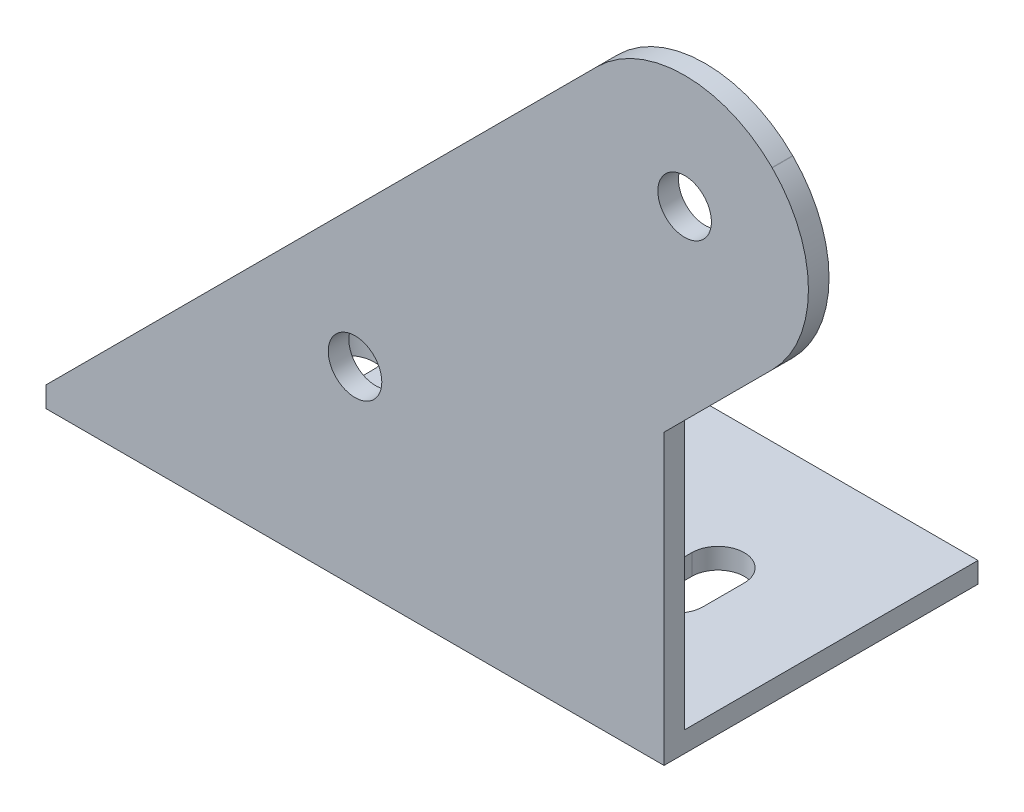
ISO-10303-21;
HEADER;
FILE_DESCRIPTION(('STEP AP214'),'2;1');
FILE_NAME('part.step','',(''),(''),'','','');
FILE_SCHEMA(('AUTOMOTIVE_DESIGN { 1 0 10303 214 1 1 1 1 }'));
ENDSEC;
DATA;
#1=APPLICATION_CONTEXT('core data for automotive mechanical design processes');
#2=APPLICATION_PROTOCOL_DEFINITION('international standard','automotive_design',2000,#1);
#3=PRODUCT_CONTEXT('',#1,'mechanical');
#4=PRODUCT('Part','Part','',(#3));
#5=PRODUCT_RELATED_PRODUCT_CATEGORY('part','',(#4));
#6=PRODUCT_DEFINITION_FORMATION('','',#4);
#7=PRODUCT_DEFINITION_CONTEXT('part definition',#1,'design');
#8=PRODUCT_DEFINITION('design','',#6,#7);
#9=PRODUCT_DEFINITION_SHAPE('','',#8);
#10=(LENGTH_UNIT() NAMED_UNIT(*) SI_UNIT(.MILLI.,.METRE.));
#11=(NAMED_UNIT(*) PLANE_ANGLE_UNIT() SI_UNIT($,.RADIAN.));
#12=(NAMED_UNIT(*) SI_UNIT($,.STERADIAN.) SOLID_ANGLE_UNIT());
#13=UNCERTAINTY_MEASURE_WITH_UNIT(LENGTH_MEASURE(1.E-05),#10,'distance_accuracy_value','');
#14=(GEOMETRIC_REPRESENTATION_CONTEXT(3) GLOBAL_UNCERTAINTY_ASSIGNED_CONTEXT((#13)) GLOBAL_UNIT_ASSIGNED_CONTEXT((#10,
#11,#12)) REPRESENTATION_CONTEXT('',''));
#15=CARTESIAN_POINT('',(0.,0.,0.));
#16=DIRECTION('',(0.,0.,1.));
#17=DIRECTION('',(1.,0.,0.));
#18=AXIS2_PLACEMENT_3D('',#15,#16,#17);
#19=CARTESIAN_POINT('',(0.,32.5735931288073,5.));
#20=DIRECTION('',(0.,0.,-1.));
#21=DIRECTION('',(-1.,0.,0.));
#22=AXIS2_PLACEMENT_3D('',#19,#20,#21);
#23=PLANE('',#22);
#24=DIRECTION('',(0.,1.,0.));
#25=VECTOR('',#24,1.);
#26=CARTESIAN_POINT('',(75.,-5.,5.));
#27=LINE('',#26,#25);
#28=CARTESIAN_POINT('',(75.,-5.,5.));
#29=VERTEX_POINT('',#28);
#30=CARTESIAN_POINT('',(75.,65.0472719955607,5.));
#31=VERTEX_POINT('',#30);
#32=EDGE_CURVE('E281',#29,#31,#27,.T.);
#33=ORIENTED_EDGE('',*,*,#32,.T.);
#34=DIRECTION('',(0.707106781186549,0.707106781186546,0.));
#35=VECTOR('',#34,1.);
#36=CARTESIAN_POINT('',(101.263160566622,91.3104325621828,5.));
#37=LINE('',#36,#35);
#38=CARTESIAN_POINT('',(101.263160566622,91.3104325621828,5.));
#39=VERTEX_POINT('',#38);
#40=EDGE_CURVE('E488',#31,#39,#37,.T.);
#41=ORIENTED_EDGE('',*,*,#40,.T.);
#42=CARTESIAN_POINT('',(80.0499571310259,112.523635997779,5.));
#43=DIRECTION('',(0.,0.,-1.));
#44=DIRECTION('',(-1.,0.,0.));
#45=AXIS2_PLACEMENT_3D('',#42,#43,#44);
#46=CIRCLE('',#45,30.);
#47=CARTESIAN_POINT('',(101.263160566622,133.736839433376,5.));
#48=VERTEX_POINT('',#47);
#49=EDGE_CURVE('E490',#39,#48,#46,.F.);
#50=ORIENTED_EDGE('',*,*,#49,.T.);
#51=DIRECTION('',(-0.707106781186548,0.707106781186548,0.));
#52=VECTOR('',#51,1.);
#53=CARTESIAN_POINT('',(101.213203435596,133.786796564402,5.));
#54=LINE('',#53,#52);
#55=CARTESIAN_POINT('',(101.213203435596,133.786796564402,5.));
#56=VERTEX_POINT('',#55);
#57=EDGE_CURVE('E493',#48,#56,#54,.T.);
#58=ORIENTED_EDGE('',*,*,#57,.T.);
#59=CARTESIAN_POINT('',(79.9999999999998,112.573593128806,5.));
#60=DIRECTION('',(0.,0.,-1.));
#61=DIRECTION('',(-1.,0.,0.));
#62=AXIS2_PLACEMENT_3D('',#59,#60,#61);
#63=CIRCLE('',#62,30.);
#64=CARTESIAN_POINT('',(58.7867965644033,133.786796564402,5.));
#65=VERTEX_POINT('',#64);
#66=EDGE_CURVE('E194',#56,#65,#63,.F.);
#67=ORIENTED_EDGE('',*,*,#66,.T.);
#68=DIRECTION('',(-0.707106781186546,-0.707106781186549,0.));
#69=VECTOR('',#68,1.);
#70=CARTESIAN_POINT('',(-75.,0.,5.));
#71=LINE('',#70,#69);
#72=CARTESIAN_POINT('',(-75.,0.,5.));
#73=VERTEX_POINT('',#72);
#74=EDGE_CURVE('E44',#65,#73,#71,.T.);
#75=ORIENTED_EDGE('',*,*,#74,.T.);
#76=DIRECTION('',(0.,1.,0.));
#77=VECTOR('',#76,1.);
#78=CARTESIAN_POINT('',(-75.,-5.,5.));
#79=LINE('',#78,#77);
#80=CARTESIAN_POINT('',(-75.,-5.,5.));
#81=VERTEX_POINT('',#80);
#82=EDGE_CURVE('E274',#81,#73,#79,.T.);
#83=ORIENTED_EDGE('',*,*,#82,.F.);
#84=DIRECTION('',(-1.,0.,0.));
#85=VECTOR('',#84,1.);
#86=CARTESIAN_POINT('',(-75.,-5.,5.));
#87=LINE('',#86,#85);
#88=EDGE_CURVE('E272',#29,#81,#87,.T.);
#89=ORIENTED_EDGE('',*,*,#88,.F.);
#90=EDGE_LOOP('',(#33,#41,#50,#58,#67,#75,#83,#89));
#91=FACE_BOUND('',#90,.T.);
#92=CARTESIAN_POINT('',(0.,41.325890400855,5.));
#93=DIRECTION('',(0.,0.,1.));
#94=DIRECTION('',(1.,0.,0.));
#95=AXIS2_PLACEMENT_3D('',#92,#93,#94);
#96=CIRCLE('',#95,6.5);
#97=CARTESIAN_POINT('',(6.5,41.325890400855,5.));
#98=VERTEX_POINT('',#97);
#99=EDGE_CURVE('E165',#98,#98,#96,.T.);
#100=ORIENTED_EDGE('',*,*,#99,.F.);
#101=EDGE_LOOP('',(#100));
#102=FACE_BOUND('',#101,.T.);
#103=CARTESIAN_POINT('',(80.,115.,5.));
#104=DIRECTION('',(0.,0.,-1.));
#105=DIRECTION('',(-1.,0.,0.));
#106=AXIS2_PLACEMENT_3D('',#103,#104,#105);
#107=CIRCLE('',#106,6.5);
#108=CARTESIAN_POINT('',(73.5,115.,5.));
#109=VERTEX_POINT('',#108);
#110=EDGE_CURVE('E215',#109,#109,#107,.F.);
#111=ORIENTED_EDGE('',*,*,#110,.F.);
#112=EDGE_LOOP('',(#111));
#113=FACE_BOUND('',#112,.T.);
#114=ADVANCED_FACE('F35',(#91,#102,#113),#23,.F.);
#115=CARTESIAN_POINT('',(0.,32.5735931288073,0.));
#116=DIRECTION('',(0.,0.,-1.));
#117=DIRECTION('',(-1.,0.,0.));
#118=AXIS2_PLACEMENT_3D('',#115,#116,#117);
#119=PLANE('',#118);
#120=DIRECTION('',(-0.707106781186546,-0.707106781186549,0.));
#121=VECTOR('',#120,1.);
#122=CARTESIAN_POINT('',(-75.,0.,0.));
#123=LINE('',#122,#121);
#124=CARTESIAN_POINT('',(58.7867965644033,133.786796564402,0.));
#125=VERTEX_POINT('',#124);
#126=CARTESIAN_POINT('',(-75.,0.,0.));
#127=VERTEX_POINT('',#126);
#128=EDGE_CURVE('E153',#125,#127,#123,.T.);
#129=ORIENTED_EDGE('',*,*,#128,.F.);
#130=CARTESIAN_POINT('',(79.9999999999998,112.573593128806,0.));
#131=DIRECTION('',(0.,0.,-1.));
#132=DIRECTION('',(-1.,0.,0.));
#133=AXIS2_PLACEMENT_3D('',#130,#131,#132);
#134=CIRCLE('',#133,30.);
#135=CARTESIAN_POINT('',(101.213203435596,133.786796564402,0.));
#136=VERTEX_POINT('',#135);
#137=EDGE_CURVE('E159',#125,#136,#134,.T.);
#138=ORIENTED_EDGE('',*,*,#137,.T.);
#139=DIRECTION('',(0.707106781186548,-0.707106781186548,0.));
#140=VECTOR('',#139,1.);
#141=CARTESIAN_POINT('',(101.213203435596,133.786796564402,0.));
#142=LINE('',#141,#140);
#143=CARTESIAN_POINT('',(101.263160566622,133.736839433376,0.));
#144=VERTEX_POINT('',#143);
#145=EDGE_CURVE('E177',#136,#144,#142,.T.);
#146=ORIENTED_EDGE('',*,*,#145,.T.);
#147=CARTESIAN_POINT('',(80.0499571310259,112.523635997779,0.));
#148=DIRECTION('',(0.,0.,-1.));
#149=DIRECTION('',(-1.,0.,0.));
#150=AXIS2_PLACEMENT_3D('',#147,#148,#149);
#151=CIRCLE('',#150,30.);
#152=CARTESIAN_POINT('',(101.263160566622,91.3104325621828,0.));
#153=VERTEX_POINT('',#152);
#154=EDGE_CURVE('E180',#144,#153,#151,.T.);
#155=ORIENTED_EDGE('',*,*,#154,.T.);
#156=DIRECTION('',(-0.707106781186549,-0.707106781186546,0.));
#157=VECTOR('',#156,1.);
#158=CARTESIAN_POINT('',(101.263160566622,91.3104325621828,0.));
#159=LINE('',#158,#157);
#160=CARTESIAN_POINT('',(75.,65.0472719955607,0.));
#161=VERTEX_POINT('',#160);
#162=EDGE_CURVE('E188',#153,#161,#159,.T.);
#163=ORIENTED_EDGE('',*,*,#162,.T.);
#164=DIRECTION('',(0.,-1.,0.));
#165=VECTOR('',#164,1.);
#166=CARTESIAN_POINT('',(75.,0.,0.));
#167=LINE('',#166,#165);
#168=CARTESIAN_POINT('',(75.,0.,0.));
#169=VERTEX_POINT('',#168);
#170=EDGE_CURVE('E172',#161,#169,#167,.T.);
#171=ORIENTED_EDGE('',*,*,#170,.T.);
#172=DIRECTION('',(1.,0.,0.));
#173=VECTOR('',#172,1.);
#174=CARTESIAN_POINT('',(75.,0.,0.));
#175=LINE('',#174,#173);
#176=EDGE_CURVE('E162',#127,#169,#175,.T.);
#177=ORIENTED_EDGE('',*,*,#176,.F.);
#178=EDGE_LOOP('',(#129,#138,#146,#155,#163,#171,#177));
#179=FACE_BOUND('',#178,.T.);
#180=CARTESIAN_POINT('',(80.,115.,0.));
#181=DIRECTION('',(0.,0.,-1.));
#182=DIRECTION('',(-1.,0.,0.));
#183=AXIS2_PLACEMENT_3D('',#180,#181,#182);
#184=CIRCLE('',#183,6.5);
#185=CARTESIAN_POINT('',(73.5,115.,0.));
#186=VERTEX_POINT('',#185);
#187=EDGE_CURVE('E178',#186,#186,#184,.T.);
#188=ORIENTED_EDGE('',*,*,#187,.F.);
#189=EDGE_LOOP('',(#188));
#190=FACE_BOUND('',#189,.T.);
#191=CARTESIAN_POINT('',(0.,41.325890400855,0.));
#192=DIRECTION('',(0.,0.,1.));
#193=DIRECTION('',(1.,0.,0.));
#194=AXIS2_PLACEMENT_3D('',#191,#192,#193);
#195=CIRCLE('',#194,6.5);
#196=CARTESIAN_POINT('',(6.5,41.325890400855,0.));
#197=VERTEX_POINT('',#196);
#198=EDGE_CURVE('E289',#197,#197,#195,.T.);
#199=ORIENTED_EDGE('',*,*,#198,.T.);
#200=EDGE_LOOP('',(#199));
#201=FACE_BOUND('',#200,.T.);
#202=ADVANCED_FACE('F155',(#179,#190,#201),#119,.T.);
#203=CARTESIAN_POINT('',(-75.,0.,5.));
#204=DIRECTION('',(0.707106781186549,-0.707106781186546,0.));
#205=DIRECTION('',(0.707106781186546,0.707106781186549,0.));
#206=AXIS2_PLACEMENT_3D('',#203,#204,#205);
#207=PLANE('',#206);
#208=ORIENTED_EDGE('',*,*,#128,.T.);
#209=DIRECTION('',(0.,0.,-1.));
#210=VECTOR('',#209,1.);
#211=CARTESIAN_POINT('',(-75.,0.,5.));
#212=LINE('',#211,#210);
#213=EDGE_CURVE('E11',#73,#127,#212,.T.);
#214=ORIENTED_EDGE('',*,*,#213,.F.);
#215=ORIENTED_EDGE('',*,*,#74,.F.);
#216=DIRECTION('',(0.,0.,-1.));
#217=VECTOR('',#216,1.);
#218=CARTESIAN_POINT('',(58.7867965644033,133.786796564402,238.603758728007));
#219=LINE('',#218,#217);
#220=EDGE_CURVE('E168',#65,#125,#219,.T.);
#221=ORIENTED_EDGE('',*,*,#220,.T.);
#222=EDGE_LOOP('',(#208,#214,#215,#221));
#223=FACE_BOUND('',#222,.T.);
#224=ADVANCED_FACE('F37',(#223),#207,.F.);
#225=CARTESIAN_POINT('',(0.,41.325890400855,5.));
#226=DIRECTION('',(0.,0.,-1.));
#227=DIRECTION('',(-1.,0.,0.));
#228=AXIS2_PLACEMENT_3D('',#225,#226,#227);
#229=CYLINDRICAL_SURFACE('',#228,6.5);
#230=ORIENTED_EDGE('',*,*,#99,.T.);
#231=EDGE_LOOP('',(#230));
#232=FACE_BOUND('',#231,.T.);
#233=ORIENTED_EDGE('',*,*,#198,.F.);
#234=EDGE_LOOP('',(#233));
#235=FACE_BOUND('',#234,.T.);
#236=ADVANCED_FACE('F320',(#232,#235),#229,.F.);
#237=CARTESIAN_POINT('',(0.,-5.,0.));
#238=DIRECTION('',(0.,1.,0.));
#239=DIRECTION('',(0.,0.,1.));
#240=AXIS2_PLACEMENT_3D('',#237,#238,#239);
#241=PLANE('',#240);
#242=CARTESIAN_POINT('',(-45.,-5.,-28.1));
#243=DIRECTION('',(0.,-1.,0.));
#244=DIRECTION('',(0.,0.,-1.));
#245=AXIS2_PLACEMENT_3D('',#242,#243,#244);
#246=CIRCLE('',#245,6.51840468515783);
#247=CARTESIAN_POINT('',(-38.4815953148422,-5.,-28.1));
#248=VERTEX_POINT('',#247);
#249=CARTESIAN_POINT('',(-51.5184046851578,-5.,-28.1));
#250=VERTEX_POINT('',#249);
#251=EDGE_CURVE('E233',#248,#250,#246,.T.);
#252=ORIENTED_EDGE('',*,*,#251,.F.);
#253=DIRECTION('',(0.,0.,1.));
#254=VECTOR('',#253,1.);
#255=CARTESIAN_POINT('',(-38.4815953148422,-5.,-28.1));
#256=LINE('',#255,#254);
#257=CARTESIAN_POINT('',(-38.4815953148422,-5.,-38.1));
#258=VERTEX_POINT('',#257);
#259=EDGE_CURVE('E241',#258,#248,#256,.T.);
#260=ORIENTED_EDGE('',*,*,#259,.F.);
#261=CARTESIAN_POINT('',(-45.,-5.,-38.1));
#262=DIRECTION('',(0.,-1.,0.));
#263=DIRECTION('',(0.,0.,-1.));
#264=AXIS2_PLACEMENT_3D('',#261,#262,#263);
#265=CIRCLE('',#264,6.51840468515783);
#266=CARTESIAN_POINT('',(-51.5184046851578,-5.,-38.1));
#267=VERTEX_POINT('',#266);
#268=EDGE_CURVE('E238',#267,#258,#265,.T.);
#269=ORIENTED_EDGE('',*,*,#268,.F.);
#270=DIRECTION('',(0.,0.,-1.));
#271=VECTOR('',#270,1.);
#272=CARTESIAN_POINT('',(-51.5184046851578,-5.,-28.1));
#273=LINE('',#272,#271);
#274=EDGE_CURVE('E235',#250,#267,#273,.T.);
#275=ORIENTED_EDGE('',*,*,#274,.F.);
#276=EDGE_LOOP('',(#252,#260,#269,#275));
#277=FACE_BOUND('',#276,.T.);
#278=DIRECTION('',(0.,0.,-1.));
#279=VECTOR('',#278,1.);
#280=CARTESIAN_POINT('',(-75.,-5.,-71.2));
#281=LINE('',#280,#279);
#282=CARTESIAN_POINT('',(-75.,-5.,-71.2));
#283=VERTEX_POINT('',#282);
#284=EDGE_CURVE('E264',#81,#283,#281,.T.);
#285=ORIENTED_EDGE('',*,*,#284,.T.);
#286=DIRECTION('',(1.,0.,0.));
#287=VECTOR('',#286,1.);
#288=CARTESIAN_POINT('',(-75.,-5.,-71.2));
#289=LINE('',#288,#287);
#290=CARTESIAN_POINT('',(75.,-5.,-71.2));
#291=VERTEX_POINT('',#290);
#292=EDGE_CURVE('E267',#283,#291,#289,.T.);
#293=ORIENTED_EDGE('',*,*,#292,.T.);
#294=DIRECTION('',(0.,0.,1.));
#295=VECTOR('',#294,1.);
#296=CARTESIAN_POINT('',(75.,-5.,-71.2));
#297=LINE('',#296,#295);
#298=EDGE_CURVE('E270',#291,#29,#297,.T.);
#299=ORIENTED_EDGE('',*,*,#298,.T.);
#300=ORIENTED_EDGE('',*,*,#88,.T.);
#301=EDGE_LOOP('',(#285,#293,#299,#300));
#302=FACE_BOUND('',#301,.T.);
#303=CARTESIAN_POINT('',(45.,-5.,-28.1));
#304=DIRECTION('',(0.,-1.,0.));
#305=DIRECTION('',(0.,0.,-1.));
#306=AXIS2_PLACEMENT_3D('',#303,#304,#305);
#307=CIRCLE('',#306,6.37253144016551);
#308=CARTESIAN_POINT('',(51.3725314401655,-5.,-28.1));
#309=VERTEX_POINT('',#308);
#310=CARTESIAN_POINT('',(38.6274685598345,-5.,-28.1));
#311=VERTEX_POINT('',#310);
#312=EDGE_CURVE('E200',#309,#311,#307,.T.);
#313=ORIENTED_EDGE('',*,*,#312,.F.);
#314=DIRECTION('',(0.,0.,1.));
#315=VECTOR('',#314,1.);
#316=CARTESIAN_POINT('',(51.3725314401655,-5.,-28.1));
#317=LINE('',#316,#315);
#318=CARTESIAN_POINT('',(51.3725314401655,-5.,-38.1));
#319=VERTEX_POINT('',#318);
#320=EDGE_CURVE('E208',#319,#309,#317,.T.);
#321=ORIENTED_EDGE('',*,*,#320,.F.);
#322=CARTESIAN_POINT('',(45.,-5.,-38.1));
#323=DIRECTION('',(0.,-1.,0.));
#324=DIRECTION('',(0.,0.,-1.));
#325=AXIS2_PLACEMENT_3D('',#322,#323,#324);
#326=CIRCLE('',#325,6.37253144016551);
#327=CARTESIAN_POINT('',(38.6274685598345,-5.,-38.1));
#328=VERTEX_POINT('',#327);
#329=EDGE_CURVE('E205',#328,#319,#326,.T.);
#330=ORIENTED_EDGE('',*,*,#329,.F.);
#331=DIRECTION('',(0.,0.,-1.));
#332=VECTOR('',#331,1.);
#333=CARTESIAN_POINT('',(38.6274685598345,-5.,-28.1));
#334=LINE('',#333,#332);
#335=EDGE_CURVE('E202',#311,#328,#334,.T.);
#336=ORIENTED_EDGE('',*,*,#335,.F.);
#337=EDGE_LOOP('',(#313,#321,#330,#336));
#338=FACE_BOUND('',#337,.T.);
#339=ADVANCED_FACE('F317',(#277,#302,#338),#241,.F.);
#340=CARTESIAN_POINT('',(0.,0.,0.));
#341=DIRECTION('',(0.,1.,0.));
#342=DIRECTION('',(0.,0.,1.));
#343=AXIS2_PLACEMENT_3D('',#340,#341,#342);
#344=PLANE('',#343);
#345=DIRECTION('',(0.,0.,-1.));
#346=VECTOR('',#345,1.);
#347=CARTESIAN_POINT('',(-75.,0.,-71.2));
#348=LINE('',#347,#346);
#349=CARTESIAN_POINT('',(-75.,0.,-71.2));
#350=VERTEX_POINT('',#349);
#351=EDGE_CURVE('E263',#127,#350,#348,.T.);
#352=ORIENTED_EDGE('',*,*,#351,.F.);
#353=ORIENTED_EDGE('',*,*,#176,.T.);
#354=DIRECTION('',(0.,0.,1.));
#355=VECTOR('',#354,1.);
#356=CARTESIAN_POINT('',(75.,0.,-71.2));
#357=LINE('',#356,#355);
#358=CARTESIAN_POINT('',(75.,0.,-71.2));
#359=VERTEX_POINT('',#358);
#360=EDGE_CURVE('E268',#359,#169,#357,.T.);
#361=ORIENTED_EDGE('',*,*,#360,.F.);
#362=DIRECTION('',(1.,0.,0.));
#363=VECTOR('',#362,1.);
#364=CARTESIAN_POINT('',(-75.,0.,-71.2));
#365=LINE('',#364,#363);
#366=EDGE_CURVE('E276',#350,#359,#365,.T.);
#367=ORIENTED_EDGE('',*,*,#366,.F.);
#368=EDGE_LOOP('',(#352,#353,#361,#367));
#369=FACE_BOUND('',#368,.T.);
#370=DIRECTION('',(0.,0.,1.));
#371=VECTOR('',#370,1.);
#372=CARTESIAN_POINT('',(-38.4815953148422,0.,-28.1));
#373=LINE('',#372,#371);
#374=CARTESIAN_POINT('',(-38.4815953148422,0.,-38.1));
#375=VERTEX_POINT('',#374);
#376=CARTESIAN_POINT('',(-38.4815953148422,0.,-28.1));
#377=VERTEX_POINT('',#376);
#378=EDGE_CURVE('E236',#375,#377,#373,.T.);
#379=ORIENTED_EDGE('',*,*,#378,.T.);
#380=CARTESIAN_POINT('',(-45.,0.,-28.1));
#381=DIRECTION('',(0.,-1.,0.));
#382=DIRECTION('',(0.,0.,-1.));
#383=AXIS2_PLACEMENT_3D('',#380,#381,#382);
#384=CIRCLE('',#383,6.51840468515783);
#385=CARTESIAN_POINT('',(-51.5184046851578,0.,-28.1));
#386=VERTEX_POINT('',#385);
#387=EDGE_CURVE('E232',#377,#386,#384,.T.);
#388=ORIENTED_EDGE('',*,*,#387,.T.);
#389=DIRECTION('',(0.,0.,-1.));
#390=VECTOR('',#389,1.);
#391=CARTESIAN_POINT('',(-51.5184046851578,0.,-28.1));
#392=LINE('',#391,#390);
#393=CARTESIAN_POINT('',(-51.5184046851578,0.,-38.1));
#394=VERTEX_POINT('',#393);
#395=EDGE_CURVE('E246',#386,#394,#392,.T.);
#396=ORIENTED_EDGE('',*,*,#395,.T.);
#397=CARTESIAN_POINT('',(-45.,0.,-38.1));
#398=DIRECTION('',(0.,-1.,0.));
#399=DIRECTION('',(0.,0.,-1.));
#400=AXIS2_PLACEMENT_3D('',#397,#398,#399);
#401=CIRCLE('',#400,6.51840468515783);
#402=EDGE_CURVE('E249',#394,#375,#401,.T.);
#403=ORIENTED_EDGE('',*,*,#402,.T.);
#404=EDGE_LOOP('',(#379,#388,#396,#403));
#405=FACE_BOUND('',#404,.T.);
#406=DIRECTION('',(0.,0.,1.));
#407=VECTOR('',#406,1.);
#408=CARTESIAN_POINT('',(51.3725314401655,0.,-28.1));
#409=LINE('',#408,#407);
#410=CARTESIAN_POINT('',(51.3725314401655,0.,-38.1));
#411=VERTEX_POINT('',#410);
#412=CARTESIAN_POINT('',(51.3725314401655,0.,-28.1));
#413=VERTEX_POINT('',#412);
#414=EDGE_CURVE('E203',#411,#413,#409,.T.);
#415=ORIENTED_EDGE('',*,*,#414,.T.);
#416=CARTESIAN_POINT('',(45.,0.,-28.1));
#417=DIRECTION('',(0.,-1.,0.));
#418=DIRECTION('',(0.,0.,-1.));
#419=AXIS2_PLACEMENT_3D('',#416,#417,#418);
#420=CIRCLE('',#419,6.37253144016551);
#421=CARTESIAN_POINT('',(38.6274685598345,0.,-28.1));
#422=VERTEX_POINT('',#421);
#423=EDGE_CURVE('E211',#413,#422,#420,.T.);
#424=ORIENTED_EDGE('',*,*,#423,.T.);
#425=DIRECTION('',(0.,0.,-1.));
#426=VECTOR('',#425,1.);
#427=CARTESIAN_POINT('',(38.6274685598345,0.,-28.1));
#428=LINE('',#427,#426);
#429=CARTESIAN_POINT('',(38.6274685598345,0.,-38.1));
#430=VERTEX_POINT('',#429);
#431=EDGE_CURVE('E214',#422,#430,#428,.T.);
#432=ORIENTED_EDGE('',*,*,#431,.T.);
#433=CARTESIAN_POINT('',(45.,0.,-38.1));
#434=DIRECTION('',(0.,-1.,0.));
#435=DIRECTION('',(0.,0.,-1.));
#436=AXIS2_PLACEMENT_3D('',#433,#434,#435);
#437=CIRCLE('',#436,6.37253144016551);
#438=EDGE_CURVE('E218',#430,#411,#437,.T.);
#439=ORIENTED_EDGE('',*,*,#438,.T.);
#440=EDGE_LOOP('',(#415,#424,#432,#439));
#441=FACE_BOUND('',#440,.T.);
#442=ADVANCED_FACE('F296',(#369,#405,#441),#344,.T.);
#443=CARTESIAN_POINT('',(-75.,-5.,-71.2));
#444=DIRECTION('',(1.,0.,0.));
#445=DIRECTION('',(0.,0.,-1.));
#446=AXIS2_PLACEMENT_3D('',#443,#444,#445);
#447=PLANE('',#446);
#448=ORIENTED_EDGE('',*,*,#213,.T.);
#449=ORIENTED_EDGE('',*,*,#351,.T.);
#450=DIRECTION('',(0.,1.,0.));
#451=VECTOR('',#450,1.);
#452=CARTESIAN_POINT('',(-75.,-5.,-71.2));
#453=LINE('',#452,#451);
#454=EDGE_CURVE('E286',#283,#350,#453,.T.);
#455=ORIENTED_EDGE('',*,*,#454,.F.);
#456=ORIENTED_EDGE('',*,*,#284,.F.);
#457=ORIENTED_EDGE('',*,*,#82,.T.);
#458=EDGE_LOOP('',(#448,#449,#455,#456,#457));
#459=FACE_BOUND('',#458,.T.);
#460=ADVANCED_FACE('F312',(#459),#447,.F.);
#461=CARTESIAN_POINT('',(-75.,-5.,-71.2));
#462=DIRECTION('',(0.,0.,1.));
#463=DIRECTION('',(1.,0.,0.));
#464=AXIS2_PLACEMENT_3D('',#461,#462,#463);
#465=PLANE('',#464);
#466=ORIENTED_EDGE('',*,*,#366,.T.);
#467=DIRECTION('',(0.,1.,0.));
#468=VECTOR('',#467,1.);
#469=CARTESIAN_POINT('',(75.,-5.,-71.2));
#470=LINE('',#469,#468);
#471=EDGE_CURVE('E283',#291,#359,#470,.T.);
#472=ORIENTED_EDGE('',*,*,#471,.F.);
#473=ORIENTED_EDGE('',*,*,#292,.F.);
#474=ORIENTED_EDGE('',*,*,#454,.T.);
#475=EDGE_LOOP('',(#466,#472,#473,#474));
#476=FACE_BOUND('',#475,.T.);
#477=ADVANCED_FACE('F308',(#476),#465,.F.);
#478=CARTESIAN_POINT('',(75.,-5.,-71.2));
#479=DIRECTION('',(-1.,0.,0.));
#480=DIRECTION('',(0.,0.,1.));
#481=AXIS2_PLACEMENT_3D('',#478,#479,#480);
#482=PLANE('',#481);
#483=ORIENTED_EDGE('',*,*,#360,.T.);
#484=ORIENTED_EDGE('',*,*,#170,.F.);
#485=DIRECTION('',(0.,0.,-1.));
#486=VECTOR('',#485,1.);
#487=CARTESIAN_POINT('',(75.,65.0472719955607,238.603758728007));
#488=LINE('',#487,#486);
#489=EDGE_CURVE('E192',#31,#161,#488,.T.);
#490=ORIENTED_EDGE('',*,*,#489,.F.);
#491=ORIENTED_EDGE('',*,*,#32,.F.);
#492=ORIENTED_EDGE('',*,*,#298,.F.);
#493=ORIENTED_EDGE('',*,*,#471,.T.);
#494=EDGE_LOOP('',(#483,#484,#490,#491,#492,#493));
#495=FACE_BOUND('',#494,.T.);
#496=ADVANCED_FACE('F303',(#495),#482,.F.);
#497=CARTESIAN_POINT('',(-45.,-5.,-28.1));
#498=DIRECTION('',(0.,1.,0.));
#499=DIRECTION('',(0.,0.,1.));
#500=AXIS2_PLACEMENT_3D('',#497,#498,#499);
#501=CYLINDRICAL_SURFACE('',#500,6.51840468515783);
#502=ORIENTED_EDGE('',*,*,#387,.F.);
#503=DIRECTION('',(0.,1.,0.));
#504=VECTOR('',#503,1.);
#505=CARTESIAN_POINT('',(-38.4815953148422,-5.,-28.1));
#506=LINE('',#505,#504);
#507=EDGE_CURVE('E243',#248,#377,#506,.T.);
#508=ORIENTED_EDGE('',*,*,#507,.F.);
#509=ORIENTED_EDGE('',*,*,#251,.T.);
#510=DIRECTION('',(0.,1.,0.));
#511=VECTOR('',#510,1.);
#512=CARTESIAN_POINT('',(-51.5184046851578,-5.,-28.1));
#513=LINE('',#512,#511);
#514=EDGE_CURVE('E260',#250,#386,#513,.T.);
#515=ORIENTED_EDGE('',*,*,#514,.T.);
#516=EDGE_LOOP('',(#502,#508,#509,#515));
#517=FACE_BOUND('',#516,.T.);
#518=ADVANCED_FACE('F364',(#517),#501,.F.);
#519=CARTESIAN_POINT('',(-51.5184046851578,-5.,-28.1));
#520=DIRECTION('',(1.,0.,0.));
#521=DIRECTION('',(0.,0.,-1.));
#522=AXIS2_PLACEMENT_3D('',#519,#520,#521);
#523=PLANE('',#522);
#524=ORIENTED_EDGE('',*,*,#395,.F.);
#525=ORIENTED_EDGE('',*,*,#514,.F.);
#526=ORIENTED_EDGE('',*,*,#274,.T.);
#527=DIRECTION('',(0.,1.,0.));
#528=VECTOR('',#527,1.);
#529=CARTESIAN_POINT('',(-51.5184046851578,-5.,-38.1));
#530=LINE('',#529,#528);
#531=EDGE_CURVE('E258',#267,#394,#530,.T.);
#532=ORIENTED_EDGE('',*,*,#531,.T.);
#533=EDGE_LOOP('',(#524,#525,#526,#532));
#534=FACE_BOUND('',#533,.T.);
#535=ADVANCED_FACE('F369',(#534),#523,.T.);
#536=CARTESIAN_POINT('',(-45.,-5.,-38.1));
#537=DIRECTION('',(0.,1.,0.));
#538=DIRECTION('',(0.,0.,1.));
#539=AXIS2_PLACEMENT_3D('',#536,#537,#538);
#540=CYLINDRICAL_SURFACE('',#539,6.51840468515783);
#541=ORIENTED_EDGE('',*,*,#402,.F.);
#542=ORIENTED_EDGE('',*,*,#531,.F.);
#543=ORIENTED_EDGE('',*,*,#268,.T.);
#544=DIRECTION('',(0.,1.,0.));
#545=VECTOR('',#544,1.);
#546=CARTESIAN_POINT('',(-38.4815953148422,-5.,-38.1));
#547=LINE('',#546,#545);
#548=EDGE_CURVE('E256',#258,#375,#547,.T.);
#549=ORIENTED_EDGE('',*,*,#548,.T.);
#550=EDGE_LOOP('',(#541,#542,#543,#549));
#551=FACE_BOUND('',#550,.T.);
#552=ADVANCED_FACE('F373',(#551),#540,.F.);
#553=CARTESIAN_POINT('',(-38.4815953148422,-5.,-28.1));
#554=DIRECTION('',(-1.,0.,0.));
#555=DIRECTION('',(0.,0.,1.));
#556=AXIS2_PLACEMENT_3D('',#553,#554,#555);
#557=PLANE('',#556);
#558=ORIENTED_EDGE('',*,*,#378,.F.);
#559=ORIENTED_EDGE('',*,*,#548,.F.);
#560=ORIENTED_EDGE('',*,*,#259,.T.);
#561=ORIENTED_EDGE('',*,*,#507,.T.);
#562=EDGE_LOOP('',(#558,#559,#560,#561));
#563=FACE_BOUND('',#562,.T.);
#564=ADVANCED_FACE('F377',(#563),#557,.T.);
#565=CARTESIAN_POINT('',(45.,-5.,-28.1));
#566=DIRECTION('',(0.,1.,0.));
#567=DIRECTION('',(0.,0.,1.));
#568=AXIS2_PLACEMENT_3D('',#565,#566,#567);
#569=CYLINDRICAL_SURFACE('',#568,6.37253144016551);
#570=ORIENTED_EDGE('',*,*,#423,.F.);
#571=DIRECTION('',(0.,1.,0.));
#572=VECTOR('',#571,1.);
#573=CARTESIAN_POINT('',(51.3725314401655,-5.,-28.1));
#574=LINE('',#573,#572);
#575=EDGE_CURVE('E210',#309,#413,#574,.T.);
#576=ORIENTED_EDGE('',*,*,#575,.F.);
#577=ORIENTED_EDGE('',*,*,#312,.T.);
#578=DIRECTION('',(0.,1.,0.));
#579=VECTOR('',#578,1.);
#580=CARTESIAN_POINT('',(38.6274685598345,-5.,-28.1));
#581=LINE('',#580,#579);
#582=EDGE_CURVE('E229',#311,#422,#581,.T.);
#583=ORIENTED_EDGE('',*,*,#582,.T.);
#584=EDGE_LOOP('',(#570,#576,#577,#583));
#585=FACE_BOUND('',#584,.T.);
#586=ADVANCED_FACE('F330',(#585),#569,.F.);
#587=CARTESIAN_POINT('',(38.6274685598345,-5.,-28.1));
#588=DIRECTION('',(1.,0.,0.));
#589=DIRECTION('',(0.,0.,-1.));
#590=AXIS2_PLACEMENT_3D('',#587,#588,#589);
#591=PLANE('',#590);
#592=ORIENTED_EDGE('',*,*,#431,.F.);
#593=ORIENTED_EDGE('',*,*,#582,.F.);
#594=ORIENTED_EDGE('',*,*,#335,.T.);
#595=DIRECTION('',(0.,1.,0.));
#596=VECTOR('',#595,1.);
#597=CARTESIAN_POINT('',(38.6274685598345,-5.,-38.1));
#598=LINE('',#597,#596);
#599=EDGE_CURVE('E227',#328,#430,#598,.T.);
#600=ORIENTED_EDGE('',*,*,#599,.T.);
#601=EDGE_LOOP('',(#592,#593,#594,#600));
#602=FACE_BOUND('',#601,.T.);
#603=ADVANCED_FACE('F332',(#602),#591,.T.);
#604=CARTESIAN_POINT('',(45.,-5.,-38.1));
#605=DIRECTION('',(0.,1.,0.));
#606=DIRECTION('',(0.,0.,1.));
#607=AXIS2_PLACEMENT_3D('',#604,#605,#606);
#608=CYLINDRICAL_SURFACE('',#607,6.37253144016551);
#609=ORIENTED_EDGE('',*,*,#438,.F.);
#610=ORIENTED_EDGE('',*,*,#599,.F.);
#611=ORIENTED_EDGE('',*,*,#329,.T.);
#612=DIRECTION('',(0.,1.,0.));
#613=VECTOR('',#612,1.);
#614=CARTESIAN_POINT('',(51.3725314401655,-5.,-38.1));
#615=LINE('',#614,#613);
#616=EDGE_CURVE('E225',#319,#411,#615,.T.);
#617=ORIENTED_EDGE('',*,*,#616,.T.);
#618=EDGE_LOOP('',(#609,#610,#611,#617));
#619=FACE_BOUND('',#618,.T.);
#620=ADVANCED_FACE('F340',(#619),#608,.F.);
#621=CARTESIAN_POINT('',(51.3725314401655,-5.,-28.1));
#622=DIRECTION('',(-1.,0.,0.));
#623=DIRECTION('',(0.,0.,1.));
#624=AXIS2_PLACEMENT_3D('',#621,#622,#623);
#625=PLANE('',#624);
#626=ORIENTED_EDGE('',*,*,#414,.F.);
#627=ORIENTED_EDGE('',*,*,#616,.F.);
#628=ORIENTED_EDGE('',*,*,#320,.T.);
#629=ORIENTED_EDGE('',*,*,#575,.T.);
#630=EDGE_LOOP('',(#626,#627,#628,#629));
#631=FACE_BOUND('',#630,.T.);
#632=ADVANCED_FACE('F338',(#631),#625,.T.);
#633=CARTESIAN_POINT('',(79.9999999999998,112.573593128806,238.603758728007));
#634=DIRECTION('',(0.,0.,-1.));
#635=DIRECTION('',(-1.,0.,0.));
#636=AXIS2_PLACEMENT_3D('',#633,#634,#635);
#637=CYLINDRICAL_SURFACE('',#636,30.);
#638=ORIENTED_EDGE('',*,*,#66,.F.);
#639=DIRECTION('',(0.,0.,-1.));
#640=VECTOR('',#639,1.);
#641=CARTESIAN_POINT('',(101.213203435596,133.786796564402,238.603758728007));
#642=LINE('',#641,#640);
#643=EDGE_CURVE('E171',#56,#136,#642,.T.);
#644=ORIENTED_EDGE('',*,*,#643,.T.);
#645=ORIENTED_EDGE('',*,*,#137,.F.);
#646=ORIENTED_EDGE('',*,*,#220,.F.);
#647=EDGE_LOOP('',(#638,#644,#645,#646));
#648=FACE_BOUND('',#647,.T.);
#649=ADVANCED_FACE('F174',(#648),#637,.T.);
#650=CARTESIAN_POINT('',(101.213203435596,133.786796564402,238.603758728007));
#651=DIRECTION('',(0.707106781186547,0.707106781186547,0.));
#652=DIRECTION('',(-0.707106781186548,0.707106781186548,0.));
#653=AXIS2_PLACEMENT_3D('',#650,#651,#652);
#654=PLANE('',#653);
#655=ORIENTED_EDGE('',*,*,#57,.F.);
#656=DIRECTION('',(0.,0.,-1.));
#657=VECTOR('',#656,1.);
#658=CARTESIAN_POINT('',(101.263160566622,133.736839433376,238.603758728007));
#659=LINE('',#658,#657);
#660=EDGE_CURVE('E197',#48,#144,#659,.T.);
#661=ORIENTED_EDGE('',*,*,#660,.T.);
#662=ORIENTED_EDGE('',*,*,#145,.F.);
#663=ORIENTED_EDGE('',*,*,#643,.F.);
#664=EDGE_LOOP('',(#655,#661,#662,#663));
#665=FACE_BOUND('',#664,.T.);
#666=ADVANCED_FACE('F437',(#665),#654,.T.);
#667=CARTESIAN_POINT('',(80.0499571310259,112.523635997779,238.603758728007));
#668=DIRECTION('',(0.,0.,-1.));
#669=DIRECTION('',(-1.,0.,0.));
#670=AXIS2_PLACEMENT_3D('',#667,#668,#669);
#671=CYLINDRICAL_SURFACE('',#670,30.);
#672=ORIENTED_EDGE('',*,*,#49,.F.);
#673=DIRECTION('',(0.,0.,-1.));
#674=VECTOR('',#673,1.);
#675=CARTESIAN_POINT('',(101.263160566622,91.3104325621828,238.603758728007));
#676=LINE('',#675,#674);
#677=EDGE_CURVE('E195',#39,#153,#676,.T.);
#678=ORIENTED_EDGE('',*,*,#677,.T.);
#679=ORIENTED_EDGE('',*,*,#154,.F.);
#680=ORIENTED_EDGE('',*,*,#660,.F.);
#681=EDGE_LOOP('',(#672,#678,#679,#680));
#682=FACE_BOUND('',#681,.T.);
#683=ADVANCED_FACE('F446',(#682),#671,.T.);
#684=CARTESIAN_POINT('',(101.263160566622,91.3104325621828,238.603758728007));
#685=DIRECTION('',(0.707106781186546,-0.707106781186549,0.));
#686=DIRECTION('',(0.707106781186549,0.707106781186546,0.));
#687=AXIS2_PLACEMENT_3D('',#684,#685,#686);
#688=PLANE('',#687);
#689=ORIENTED_EDGE('',*,*,#40,.F.);
#690=ORIENTED_EDGE('',*,*,#489,.T.);
#691=ORIENTED_EDGE('',*,*,#162,.F.);
#692=ORIENTED_EDGE('',*,*,#677,.F.);
#693=EDGE_LOOP('',(#689,#690,#691,#692));
#694=FACE_BOUND('',#693,.T.);
#695=ADVANCED_FACE('F456',(#694),#688,.T.);
#696=CARTESIAN_POINT('',(80.,115.,238.603758728007));
#697=DIRECTION('',(0.,0.,-1.));
#698=DIRECTION('',(-1.,0.,0.));
#699=AXIS2_PLACEMENT_3D('',#696,#697,#698);
#700=CYLINDRICAL_SURFACE('',#699,6.5);
#701=ORIENTED_EDGE('',*,*,#110,.T.);
#702=EDGE_LOOP('',(#701));
#703=FACE_BOUND('',#702,.T.);
#704=ORIENTED_EDGE('',*,*,#187,.T.);
#705=EDGE_LOOP('',(#704));
#706=FACE_BOUND('',#705,.T.);
#707=ADVANCED_FACE('F466',(#703,#706),#700,.F.);
#708=CLOSED_SHELL('',(#114,#202,#224,#236,#339,#442,#460,#477,#496,#518,#535,#552,#564,#586,
#603,#620,#632,#649,#666,#683,#695,#707));
#709=MANIFOLD_SOLID_BREP('B2',#708);
#710=ADVANCED_BREP_SHAPE_REPRESENTATION('',(#18,#709),#14);
#711=SHAPE_DEFINITION_REPRESENTATION(#9,#710);
ENDSEC;
END-ISO-10303-21;
